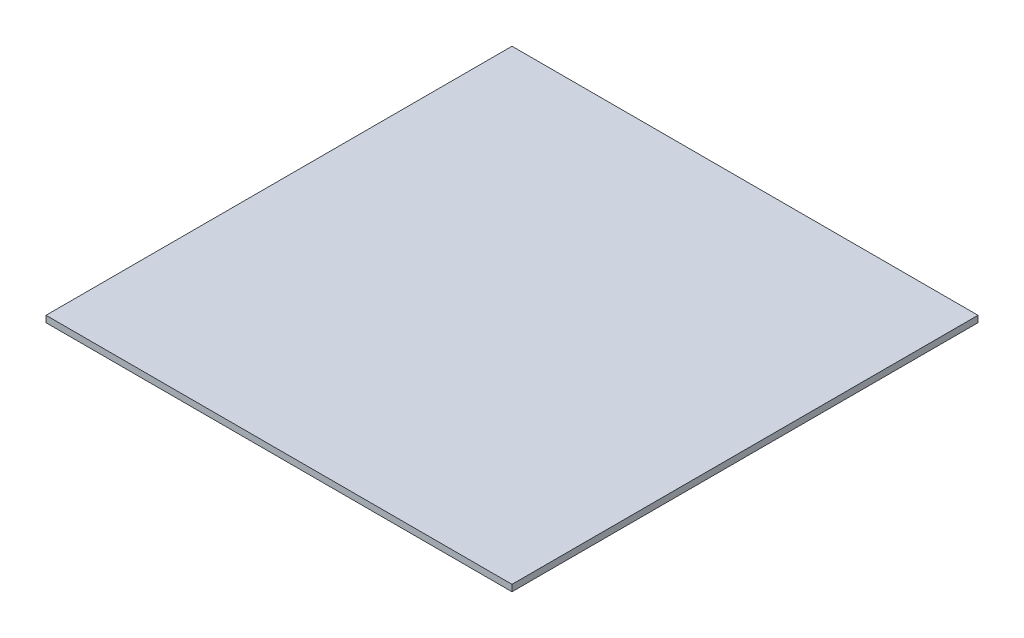
ISO-10303-21;
HEADER;
FILE_DESCRIPTION(('STEP AP214'),'2;1');
FILE_NAME('part.step','',(''),(''),'','','');
FILE_SCHEMA(('AUTOMOTIVE_DESIGN { 1 0 10303 214 1 1 1 1 }'));
ENDSEC;
DATA;
#1=APPLICATION_CONTEXT('core data for automotive mechanical design processes');
#2=APPLICATION_PROTOCOL_DEFINITION('international standard','automotive_design',2000,#1);
#3=PRODUCT_CONTEXT('',#1,'mechanical');
#4=PRODUCT('Part','Part','',(#3));
#5=PRODUCT_RELATED_PRODUCT_CATEGORY('part','',(#4));
#6=PRODUCT_DEFINITION_FORMATION('','',#4);
#7=PRODUCT_DEFINITION_CONTEXT('part definition',#1,'design');
#8=PRODUCT_DEFINITION('design','',#6,#7);
#9=PRODUCT_DEFINITION_SHAPE('','',#8);
#10=(LENGTH_UNIT() NAMED_UNIT(*) SI_UNIT(.MILLI.,.METRE.));
#11=(NAMED_UNIT(*) PLANE_ANGLE_UNIT() SI_UNIT($,.RADIAN.));
#12=(NAMED_UNIT(*) SI_UNIT($,.STERADIAN.) SOLID_ANGLE_UNIT());
#13=UNCERTAINTY_MEASURE_WITH_UNIT(LENGTH_MEASURE(1.E-05),#10,'distance_accuracy_value','');
#14=(GEOMETRIC_REPRESENTATION_CONTEXT(3) GLOBAL_UNCERTAINTY_ASSIGNED_CONTEXT((#13)) GLOBAL_UNIT_ASSIGNED_CONTEXT((#10,
#11,#12)) REPRESENTATION_CONTEXT('',''));
#15=CARTESIAN_POINT('',(0.,0.,0.));
#16=DIRECTION('',(0.,0.,1.));
#17=DIRECTION('',(1.,0.,0.));
#18=AXIS2_PLACEMENT_3D('',#15,#16,#17);
#19=CARTESIAN_POINT('',(900.,25.,-900.));
#20=DIRECTION('',(-1.,0.,0.));
#21=DIRECTION('',(0.,0.,1.));
#22=AXIS2_PLACEMENT_3D('',#19,#20,#21);
#23=PLANE('',#22);
#24=DIRECTION('',(0.,0.,-1.));
#25=VECTOR('',#24,1.);
#26=CARTESIAN_POINT('',(900.,0.,-900.));
#27=LINE('',#26,#25);
#28=CARTESIAN_POINT('',(900.,0.,900.));
#29=VERTEX_POINT('',#28);
#30=CARTESIAN_POINT('',(900.,0.,-900.));
#31=VERTEX_POINT('',#30);
#32=EDGE_CURVE('E107',#29,#31,#27,.T.);
#33=ORIENTED_EDGE('',*,*,#32,.T.);
#34=DIRECTION('',(0.,-1.,0.));
#35=VECTOR('',#34,1.);
#36=CARTESIAN_POINT('',(900.,25.,-900.));
#37=LINE('',#36,#35);
#38=CARTESIAN_POINT('',(900.,25.,-900.));
#39=VERTEX_POINT('',#38);
#40=EDGE_CURVE('E11',#39,#31,#37,.T.);
#41=ORIENTED_EDGE('',*,*,#40,.F.);
#42=DIRECTION('',(0.,0.,-1.));
#43=VECTOR('',#42,1.);
#44=CARTESIAN_POINT('',(900.,25.,-900.));
#45=LINE('',#44,#43);
#46=CARTESIAN_POINT('',(900.,25.,900.));
#47=VERTEX_POINT('',#46);
#48=EDGE_CURVE('E91',#47,#39,#45,.T.);
#49=ORIENTED_EDGE('',*,*,#48,.F.);
#50=DIRECTION('',(0.,-1.,0.));
#51=VECTOR('',#50,1.);
#52=CARTESIAN_POINT('',(900.,25.,900.));
#53=LINE('',#52,#51);
#54=EDGE_CURVE('E103',#47,#29,#53,.T.);
#55=ORIENTED_EDGE('',*,*,#54,.T.);
#56=EDGE_LOOP('',(#33,#41,#49,#55));
#57=FACE_BOUND('',#56,.T.);
#58=ADVANCED_FACE('F39',(#57),#23,.F.);
#59=CARTESIAN_POINT('',(-900.,25.,-900.));
#60=DIRECTION('',(0.,0.,1.));
#61=DIRECTION('',(1.,0.,0.));
#62=AXIS2_PLACEMENT_3D('',#59,#60,#61);
#63=PLANE('',#62);
#64=DIRECTION('',(-1.,0.,0.));
#65=VECTOR('',#64,1.);
#66=CARTESIAN_POINT('',(-900.,0.,-900.));
#67=LINE('',#66,#65);
#68=CARTESIAN_POINT('',(-900.,0.,-900.));
#69=VERTEX_POINT('',#68);
#70=EDGE_CURVE('E96',#31,#69,#67,.T.);
#71=ORIENTED_EDGE('',*,*,#70,.T.);
#72=DIRECTION('',(0.,-1.,0.));
#73=VECTOR('',#72,1.);
#74=CARTESIAN_POINT('',(-900.,25.,-900.));
#75=LINE('',#74,#73);
#76=CARTESIAN_POINT('',(-900.,25.,-900.));
#77=VERTEX_POINT('',#76);
#78=EDGE_CURVE('E48',#77,#69,#75,.T.);
#79=ORIENTED_EDGE('',*,*,#78,.F.);
#80=DIRECTION('',(-1.,0.,0.));
#81=VECTOR('',#80,1.);
#82=CARTESIAN_POINT('',(-900.,25.,-900.));
#83=LINE('',#82,#81);
#84=EDGE_CURVE('E86',#39,#77,#83,.T.);
#85=ORIENTED_EDGE('',*,*,#84,.F.);
#86=ORIENTED_EDGE('',*,*,#40,.T.);
#87=EDGE_LOOP('',(#71,#79,#85,#86));
#88=FACE_BOUND('',#87,.T.);
#89=ADVANCED_FACE('F95',(#88),#63,.F.);
#90=CARTESIAN_POINT('',(-900.,25.,-900.));
#91=DIRECTION('',(1.,0.,0.));
#92=DIRECTION('',(0.,0.,-1.));
#93=AXIS2_PLACEMENT_3D('',#90,#91,#92);
#94=PLANE('',#93);
#95=DIRECTION('',(0.,0.,1.));
#96=VECTOR('',#95,1.);
#97=CARTESIAN_POINT('',(-900.,0.,-900.));
#98=LINE('',#97,#96);
#99=CARTESIAN_POINT('',(-900.,0.,900.));
#100=VERTEX_POINT('',#99);
#101=EDGE_CURVE('E73',#69,#100,#98,.T.);
#102=ORIENTED_EDGE('',*,*,#101,.T.);
#103=DIRECTION('',(0.,-1.,0.));
#104=VECTOR('',#103,1.);
#105=CARTESIAN_POINT('',(-900.,25.,900.));
#106=LINE('',#105,#104);
#107=CARTESIAN_POINT('',(-900.,25.,900.));
#108=VERTEX_POINT('',#107);
#109=EDGE_CURVE('E98',#108,#100,#106,.T.);
#110=ORIENTED_EDGE('',*,*,#109,.F.);
#111=DIRECTION('',(0.,0.,1.));
#112=VECTOR('',#111,1.);
#113=CARTESIAN_POINT('',(-900.,25.,-900.));
#114=LINE('',#113,#112);
#115=EDGE_CURVE('E89',#77,#108,#114,.T.);
#116=ORIENTED_EDGE('',*,*,#115,.F.);
#117=ORIENTED_EDGE('',*,*,#78,.T.);
#118=EDGE_LOOP('',(#102,#110,#116,#117));
#119=FACE_BOUND('',#118,.T.);
#120=ADVANCED_FACE('F99',(#119),#94,.F.);
#121=CARTESIAN_POINT('',(-900.,25.,900.));
#122=DIRECTION('',(0.,0.,-1.));
#123=DIRECTION('',(-1.,0.,0.));
#124=AXIS2_PLACEMENT_3D('',#121,#122,#123);
#125=PLANE('',#124);
#126=DIRECTION('',(1.,0.,0.));
#127=VECTOR('',#126,1.);
#128=CARTESIAN_POINT('',(-900.,0.,900.));
#129=LINE('',#128,#127);
#130=EDGE_CURVE('E79',#100,#29,#129,.T.);
#131=ORIENTED_EDGE('',*,*,#130,.T.);
#132=ORIENTED_EDGE('',*,*,#54,.F.);
#133=DIRECTION('',(1.,0.,0.));
#134=VECTOR('',#133,1.);
#135=CARTESIAN_POINT('',(-900.,25.,900.));
#136=LINE('',#135,#134);
#137=EDGE_CURVE('E56',#108,#47,#136,.T.);
#138=ORIENTED_EDGE('',*,*,#137,.F.);
#139=ORIENTED_EDGE('',*,*,#109,.T.);
#140=EDGE_LOOP('',(#131,#132,#138,#139));
#141=FACE_BOUND('',#140,.T.);
#142=ADVANCED_FACE('F120',(#141),#125,.F.);
#143=CARTESIAN_POINT('',(0.,25.,0.));
#144=DIRECTION('',(0.,1.,0.));
#145=DIRECTION('',(0.,0.,1.));
#146=AXIS2_PLACEMENT_3D('',#143,#144,#145);
#147=PLANE('',#146);
#148=ORIENTED_EDGE('',*,*,#48,.T.);
#149=ORIENTED_EDGE('',*,*,#84,.T.);
#150=ORIENTED_EDGE('',*,*,#115,.T.);
#151=ORIENTED_EDGE('',*,*,#137,.T.);
#152=EDGE_LOOP('',(#148,#149,#150,#151));
#153=FACE_BOUND('',#152,.T.);
#154=ADVANCED_FACE('F87',(#153),#147,.T.);
#155=CARTESIAN_POINT('',(0.,0.,0.));
#156=DIRECTION('',(0.,1.,0.));
#157=DIRECTION('',(0.,0.,1.));
#158=AXIS2_PLACEMENT_3D('',#155,#156,#157);
#159=PLANE('',#158);
#160=ORIENTED_EDGE('',*,*,#32,.F.);
#161=ORIENTED_EDGE('',*,*,#130,.F.);
#162=ORIENTED_EDGE('',*,*,#101,.F.);
#163=ORIENTED_EDGE('',*,*,#70,.F.);
#164=EDGE_LOOP('',(#160,#161,#162,#163));
#165=FACE_BOUND('',#164,.T.);
#166=ADVANCED_FACE('F123',(#165),#159,.F.);
#167=CLOSED_SHELL('',(#58,#89,#120,#142,#154,#166));
#168=MANIFOLD_SOLID_BREP('B2',#167);
#169=ADVANCED_BREP_SHAPE_REPRESENTATION('',(#18,#168),#14);
#170=SHAPE_DEFINITION_REPRESENTATION(#9,#169);
ENDSEC;
END-ISO-10303-21;
